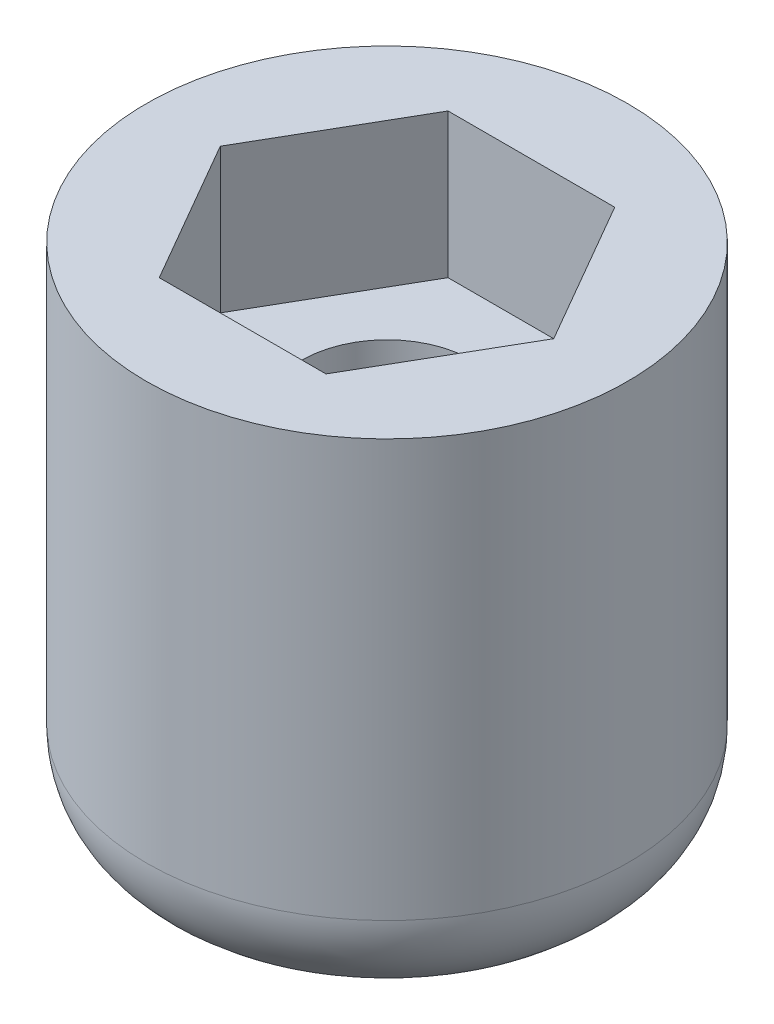
ISO-10303-21;
HEADER;
FILE_DESCRIPTION(('STEP AP214'),'2;1');
FILE_NAME('part.step','',(''),(''),'','','');
FILE_SCHEMA(('AUTOMOTIVE_DESIGN { 1 0 10303 214 1 1 1 1 }'));
ENDSEC;
DATA;
#1=APPLICATION_CONTEXT('core data for automotive mechanical design processes');
#2=APPLICATION_PROTOCOL_DEFINITION('international standard','automotive_design',2000,#1);
#3=PRODUCT_CONTEXT('',#1,'mechanical');
#4=PRODUCT('Part','Part','',(#3));
#5=PRODUCT_RELATED_PRODUCT_CATEGORY('part','',(#4));
#6=PRODUCT_DEFINITION_FORMATION('','',#4);
#7=PRODUCT_DEFINITION_CONTEXT('part definition',#1,'design');
#8=PRODUCT_DEFINITION('design','',#6,#7);
#9=PRODUCT_DEFINITION_SHAPE('','',#8);
#10=(LENGTH_UNIT() NAMED_UNIT(*) SI_UNIT(.MILLI.,.METRE.));
#11=(NAMED_UNIT(*) PLANE_ANGLE_UNIT() SI_UNIT($,.RADIAN.));
#12=(NAMED_UNIT(*) SI_UNIT($,.STERADIAN.) SOLID_ANGLE_UNIT());
#13=UNCERTAINTY_MEASURE_WITH_UNIT(LENGTH_MEASURE(1.E-05),#10,'distance_accuracy_value','');
#14=(GEOMETRIC_REPRESENTATION_CONTEXT(3) GLOBAL_UNCERTAINTY_ASSIGNED_CONTEXT((#13)) GLOBAL_UNIT_ASSIGNED_CONTEXT((#10,
#11,#12)) REPRESENTATION_CONTEXT('',''));
#15=CARTESIAN_POINT('',(0.,0.,0.));
#16=DIRECTION('',(0.,0.,1.));
#17=DIRECTION('',(1.,0.,0.));
#18=AXIS2_PLACEMENT_3D('',#15,#16,#17);
#19=CARTESIAN_POINT('',(0.,16.,0.));
#20=DIRECTION('',(0.,-1.,0.));
#21=DIRECTION('',(0.,0.,-1.));
#22=AXIS2_PLACEMENT_3D('',#19,#20,#21);
#23=CYLINDRICAL_SURFACE('',#22,2.65);
#24=CARTESIAN_POINT('',(0.,10.,0.));
#25=DIRECTION('',(0.,1.,0.));
#26=DIRECTION('',(0.,0.,1.));
#27=AXIS2_PLACEMENT_3D('',#24,#25,#26);
#28=CIRCLE('',#27,2.65);
#29=CARTESIAN_POINT('',(0.,10.,2.65));
#30=VERTEX_POINT('',#29);
#31=EDGE_CURVE('E146',#30,#30,#28,.T.);
#32=ORIENTED_EDGE('',*,*,#31,.F.);
#33=EDGE_LOOP('',(#32));
#34=FACE_BOUND('',#33,.T.);
#35=CARTESIAN_POINT('',(0.,11.5,0.));
#36=DIRECTION('',(0.,1.,0.));
#37=DIRECTION('',(0.,0.,1.));
#38=AXIS2_PLACEMENT_3D('',#35,#36,#37);
#39=CIRCLE('',#38,2.65);
#40=CARTESIAN_POINT('',(0.,11.5,2.65));
#41=VERTEX_POINT('',#40);
#42=EDGE_CURVE('E140',#41,#41,#39,.T.);
#43=ORIENTED_EDGE('',*,*,#42,.T.);
#44=EDGE_LOOP('',(#43));
#45=FACE_BOUND('',#44,.T.);
#46=ADVANCED_FACE('F38',(#34,#45),#23,.F.);
#47=CARTESIAN_POINT('',(0.,10.,0.));
#48=DIRECTION('',(0.,-1.,0.));
#49=DIRECTION('',(0.,0.,-1.));
#50=AXIS2_PLACEMENT_3D('',#47,#48,#49);
#51=CYLINDRICAL_SURFACE('',#50,7.5);
#52=CARTESIAN_POINT('',(0.,3.,0.));
#53=DIRECTION('',(0.,1.,0.));
#54=DIRECTION('',(0.,0.,1.));
#55=AXIS2_PLACEMENT_3D('',#52,#53,#54);
#56=CIRCLE('',#55,7.5);
#57=CARTESIAN_POINT('',(0.,3.,7.5));
#58=VERTEX_POINT('',#57);
#59=EDGE_CURVE('E155',#58,#58,#56,.T.);
#60=ORIENTED_EDGE('',*,*,#59,.T.);
#61=EDGE_LOOP('',(#60));
#62=FACE_BOUND('',#61,.T.);
#63=CARTESIAN_POINT('',(0.,16.,0.));
#64=DIRECTION('',(0.,1.,0.));
#65=DIRECTION('',(0.,0.,1.));
#66=AXIS2_PLACEMENT_3D('',#63,#64,#65);
#67=CIRCLE('',#66,7.5);
#68=CARTESIAN_POINT('',(0.,16.,7.5));
#69=VERTEX_POINT('',#68);
#70=EDGE_CURVE('E149',#69,#69,#67,.T.);
#71=ORIENTED_EDGE('',*,*,#70,.F.);
#72=EDGE_LOOP('',(#71));
#73=FACE_BOUND('',#72,.T.);
#74=ADVANCED_FACE('F172',(#62,#73),#51,.T.);
#75=CARTESIAN_POINT('',(0.,10.,0.));
#76=DIRECTION('',(0.,-1.,0.));
#77=DIRECTION('',(0.,0.,-1.));
#78=AXIS2_PLACEMENT_3D('',#75,#76,#77);
#79=CYLINDRICAL_SURFACE('',#78,4.5);
#80=CARTESIAN_POINT('',(0.,1.26794919243112,0.));
#81=DIRECTION('',(0.,-1.,0.));
#82=DIRECTION('',(0.,0.,-1.));
#83=AXIS2_PLACEMENT_3D('',#80,#81,#82);
#84=CIRCLE('',#83,4.5);
#85=CARTESIAN_POINT('',(0.,1.26794919243112,-4.5));
#86=VERTEX_POINT('',#85);
#87=EDGE_CURVE('E11',#86,#86,#84,.T.);
#88=ORIENTED_EDGE('',*,*,#87,.T.);
#89=EDGE_LOOP('',(#88));
#90=FACE_BOUND('',#89,.T.);
#91=CARTESIAN_POINT('',(0.,10.,0.));
#92=DIRECTION('',(0.,1.,0.));
#93=DIRECTION('',(0.,0.,1.));
#94=AXIS2_PLACEMENT_3D('',#91,#92,#93);
#95=CIRCLE('',#94,4.5);
#96=CARTESIAN_POINT('',(0.,10.,4.5));
#97=VERTEX_POINT('',#96);
#98=EDGE_CURVE('E152',#97,#97,#95,.T.);
#99=ORIENTED_EDGE('',*,*,#98,.T.);
#100=EDGE_LOOP('',(#99));
#101=FACE_BOUND('',#100,.T.);
#102=ADVANCED_FACE('F179',(#90,#101),#79,.F.);
#103=CARTESIAN_POINT('',(0.,10.,0.));
#104=DIRECTION('',(0.,1.,0.));
#105=DIRECTION('',(0.,0.,1.));
#106=AXIS2_PLACEMENT_3D('',#103,#104,#105);
#107=PLANE('',#106);
#108=ORIENTED_EDGE('',*,*,#31,.T.);
#109=EDGE_LOOP('',(#108));
#110=FACE_BOUND('',#109,.T.);
#111=ORIENTED_EDGE('',*,*,#98,.F.);
#112=EDGE_LOOP('',(#111));
#113=FACE_BOUND('',#112,.T.);
#114=ADVANCED_FACE('F191',(#110,#113),#107,.F.);
#115=CARTESIAN_POINT('',(0.,16.,0.));
#116=DIRECTION('',(0.,1.,0.));
#117=DIRECTION('',(0.,0.,1.));
#118=AXIS2_PLACEMENT_3D('',#115,#116,#117);
#119=PLANE('',#118);
#120=DIRECTION('',(-0.500000000000001,0.,-0.866025403784438));
#121=VECTOR('',#120,1.);
#122=CARTESIAN_POINT('',(5.19615242270663,16.,0.));
#123=LINE('',#122,#121);
#124=CARTESIAN_POINT('',(5.19615242270663,16.,0.));
#125=VERTEX_POINT('',#124);
#126=CARTESIAN_POINT('',(2.59807621135331,16.,-4.5));
#127=VERTEX_POINT('',#126);
#128=EDGE_CURVE('E53',#125,#127,#123,.T.);
#129=ORIENTED_EDGE('',*,*,#128,.F.);
#130=DIRECTION('',(0.5,0.,-0.866025403784439));
#131=VECTOR('',#130,1.);
#132=CARTESIAN_POINT('',(2.59807621135332,16.,4.5));
#133=LINE('',#132,#131);
#134=CARTESIAN_POINT('',(2.59807621135332,16.,4.5));
#135=VERTEX_POINT('',#134);
#136=EDGE_CURVE('E136',#135,#125,#133,.T.);
#137=ORIENTED_EDGE('',*,*,#136,.F.);
#138=DIRECTION('',(1.,0.,0.));
#139=VECTOR('',#138,1.);
#140=CARTESIAN_POINT('',(-2.59807621135331,16.,4.5));
#141=LINE('',#140,#139);
#142=CARTESIAN_POINT('',(-2.59807621135331,16.,4.5));
#143=VERTEX_POINT('',#142);
#144=EDGE_CURVE('E134',#143,#135,#141,.T.);
#145=ORIENTED_EDGE('',*,*,#144,.F.);
#146=DIRECTION('',(0.5,0.,0.866025403784438));
#147=VECTOR('',#146,1.);
#148=CARTESIAN_POINT('',(-5.19615242270663,16.,0.));
#149=LINE('',#148,#147);
#150=CARTESIAN_POINT('',(-5.19615242270663,16.,0.));
#151=VERTEX_POINT('',#150);
#152=EDGE_CURVE('E101',#151,#143,#149,.T.);
#153=ORIENTED_EDGE('',*,*,#152,.F.);
#154=DIRECTION('',(-0.5,0.,0.866025403784439));
#155=VECTOR('',#154,1.);
#156=CARTESIAN_POINT('',(-2.59807621135331,16.,-4.5));
#157=LINE('',#156,#155);
#158=CARTESIAN_POINT('',(-2.59807621135331,16.,-4.5));
#159=VERTEX_POINT('',#158);
#160=EDGE_CURVE('E130',#159,#151,#157,.T.);
#161=ORIENTED_EDGE('',*,*,#160,.F.);
#162=DIRECTION('',(-1.,0.,0.));
#163=VECTOR('',#162,1.);
#164=CARTESIAN_POINT('',(2.59807621135331,16.,-4.5));
#165=LINE('',#164,#163);
#166=EDGE_CURVE('E127',#127,#159,#165,.T.);
#167=ORIENTED_EDGE('',*,*,#166,.F.);
#168=EDGE_LOOP('',(#129,#137,#145,#153,#161,#167));
#169=FACE_BOUND('',#168,.T.);
#170=ORIENTED_EDGE('',*,*,#70,.T.);
#171=EDGE_LOOP('',(#170));
#172=FACE_BOUND('',#171,.T.);
#173=ADVANCED_FACE('F188',(#169,#172),#119,.T.);
#174=CARTESIAN_POINT('',(5.19615242270663,11.5,0.));
#175=DIRECTION('',(0.866025403784438,0.,-0.500000000000001));
#176=DIRECTION('',(-0.500000000000001,0.,-0.866025403784438));
#177=AXIS2_PLACEMENT_3D('',#174,#175,#176);
#178=PLANE('',#177);
#179=ORIENTED_EDGE('',*,*,#128,.T.);
#180=DIRECTION('',(0.,1.,0.));
#181=VECTOR('',#180,1.);
#182=CARTESIAN_POINT('',(2.59807621135331,11.5,-4.5));
#183=LINE('',#182,#181);
#184=CARTESIAN_POINT('',(2.59807621135331,11.5,-4.5));
#185=VERTEX_POINT('',#184);
#186=EDGE_CURVE('E83',#185,#127,#183,.T.);
#187=ORIENTED_EDGE('',*,*,#186,.F.);
#188=DIRECTION('',(-0.500000000000001,0.,-0.866025403784438));
#189=VECTOR('',#188,1.);
#190=CARTESIAN_POINT('',(5.19615242270663,11.5,0.));
#191=LINE('',#190,#189);
#192=CARTESIAN_POINT('',(5.19615242270663,11.5,0.));
#193=VERTEX_POINT('',#192);
#194=EDGE_CURVE('E138',#193,#185,#191,.T.);
#195=ORIENTED_EDGE('',*,*,#194,.F.);
#196=DIRECTION('',(0.,1.,0.));
#197=VECTOR('',#196,1.);
#198=CARTESIAN_POINT('',(5.19615242270663,11.5,0.));
#199=LINE('',#198,#197);
#200=EDGE_CURVE('E61',#193,#125,#199,.T.);
#201=ORIENTED_EDGE('',*,*,#200,.T.);
#202=EDGE_LOOP('',(#179,#187,#195,#201));
#203=FACE_BOUND('',#202,.T.);
#204=ADVANCED_FACE('F186',(#203),#178,.F.);
#205=CARTESIAN_POINT('',(2.59807621135332,11.5,4.5));
#206=DIRECTION('',(0.866025403784439,0.,0.5));
#207=DIRECTION('',(0.5,0.,-0.866025403784439));
#208=AXIS2_PLACEMENT_3D('',#205,#206,#207);
#209=PLANE('',#208);
#210=ORIENTED_EDGE('',*,*,#136,.T.);
#211=ORIENTED_EDGE('',*,*,#200,.F.);
#212=DIRECTION('',(0.5,0.,-0.866025403784439));
#213=VECTOR('',#212,1.);
#214=CARTESIAN_POINT('',(2.59807621135332,11.5,4.5));
#215=LINE('',#214,#213);
#216=CARTESIAN_POINT('',(2.59807621135332,11.5,4.5));
#217=VERTEX_POINT('',#216);
#218=EDGE_CURVE('E113',#217,#193,#215,.T.);
#219=ORIENTED_EDGE('',*,*,#218,.F.);
#220=DIRECTION('',(0.,1.,0.));
#221=VECTOR('',#220,1.);
#222=CARTESIAN_POINT('',(2.59807621135332,11.5,4.5));
#223=LINE('',#222,#221);
#224=EDGE_CURVE('E105',#217,#135,#223,.T.);
#225=ORIENTED_EDGE('',*,*,#224,.T.);
#226=EDGE_LOOP('',(#210,#211,#219,#225));
#227=FACE_BOUND('',#226,.T.);
#228=ADVANCED_FACE('F261',(#227),#209,.F.);
#229=CARTESIAN_POINT('',(-2.59807621135331,11.5,4.5));
#230=DIRECTION('',(0.,0.,1.));
#231=DIRECTION('',(1.,0.,0.));
#232=AXIS2_PLACEMENT_3D('',#229,#230,#231);
#233=PLANE('',#232);
#234=ORIENTED_EDGE('',*,*,#144,.T.);
#235=ORIENTED_EDGE('',*,*,#224,.F.);
#236=DIRECTION('',(1.,0.,0.));
#237=VECTOR('',#236,1.);
#238=CARTESIAN_POINT('',(-2.59807621135331,11.5,4.5));
#239=LINE('',#238,#237);
#240=CARTESIAN_POINT('',(-2.59807621135331,11.5,4.5));
#241=VERTEX_POINT('',#240);
#242=EDGE_CURVE('E109',#241,#217,#239,.T.);
#243=ORIENTED_EDGE('',*,*,#242,.F.);
#244=DIRECTION('',(0.,1.,0.));
#245=VECTOR('',#244,1.);
#246=CARTESIAN_POINT('',(-2.59807621135331,11.5,4.5));
#247=LINE('',#246,#245);
#248=EDGE_CURVE('E94',#241,#143,#247,.T.);
#249=ORIENTED_EDGE('',*,*,#248,.T.);
#250=EDGE_LOOP('',(#234,#235,#243,#249));
#251=FACE_BOUND('',#250,.T.);
#252=ADVANCED_FACE('F110',(#251),#233,.F.);
#253=CARTESIAN_POINT('',(-5.19615242270663,11.5,0.));
#254=DIRECTION('',(-0.866025403784438,0.,0.5));
#255=DIRECTION('',(0.5,0.,0.866025403784439));
#256=AXIS2_PLACEMENT_3D('',#253,#254,#255);
#257=PLANE('',#256);
#258=ORIENTED_EDGE('',*,*,#152,.T.);
#259=ORIENTED_EDGE('',*,*,#248,.F.);
#260=DIRECTION('',(0.5,0.,0.866025403784438));
#261=VECTOR('',#260,1.);
#262=CARTESIAN_POINT('',(-5.19615242270663,11.5,0.));
#263=LINE('',#262,#261);
#264=CARTESIAN_POINT('',(-5.19615242270663,11.5,0.));
#265=VERTEX_POINT('',#264);
#266=EDGE_CURVE('E98',#265,#241,#263,.T.);
#267=ORIENTED_EDGE('',*,*,#266,.F.);
#268=DIRECTION('',(0.,1.,0.));
#269=VECTOR('',#268,1.);
#270=CARTESIAN_POINT('',(-5.19615242270663,11.5,0.));
#271=LINE('',#270,#269);
#272=EDGE_CURVE('E106',#265,#151,#271,.T.);
#273=ORIENTED_EDGE('',*,*,#272,.T.);
#274=EDGE_LOOP('',(#258,#259,#267,#273));
#275=FACE_BOUND('',#274,.T.);
#276=ADVANCED_FACE('F96',(#275),#257,.F.);
#277=CARTESIAN_POINT('',(-2.59807621135331,11.5,-4.5));
#278=DIRECTION('',(-0.866025403784439,0.,-0.5));
#279=DIRECTION('',(-0.5,0.,0.866025403784439));
#280=AXIS2_PLACEMENT_3D('',#277,#278,#279);
#281=PLANE('',#280);
#282=ORIENTED_EDGE('',*,*,#160,.T.);
#283=ORIENTED_EDGE('',*,*,#272,.F.);
#284=DIRECTION('',(-0.5,0.,0.866025403784439));
#285=VECTOR('',#284,1.);
#286=CARTESIAN_POINT('',(-2.59807621135331,11.5,-4.5));
#287=LINE('',#286,#285);
#288=CARTESIAN_POINT('',(-2.59807621135331,11.5,-4.5));
#289=VERTEX_POINT('',#288);
#290=EDGE_CURVE('E119',#289,#265,#287,.T.);
#291=ORIENTED_EDGE('',*,*,#290,.F.);
#292=DIRECTION('',(0.,1.,0.));
#293=VECTOR('',#292,1.);
#294=CARTESIAN_POINT('',(-2.59807621135331,11.5,-4.5));
#295=LINE('',#294,#293);
#296=EDGE_CURVE('E143',#289,#159,#295,.T.);
#297=ORIENTED_EDGE('',*,*,#296,.T.);
#298=EDGE_LOOP('',(#282,#283,#291,#297));
#299=FACE_BOUND('',#298,.T.);
#300=ADVANCED_FACE('F235',(#299),#281,.F.);
#301=CARTESIAN_POINT('',(2.59807621135331,11.5,-4.5));
#302=DIRECTION('',(0.,0.,-1.));
#303=DIRECTION('',(-1.,0.,0.));
#304=AXIS2_PLACEMENT_3D('',#301,#302,#303);
#305=PLANE('',#304);
#306=ORIENTED_EDGE('',*,*,#166,.T.);
#307=ORIENTED_EDGE('',*,*,#296,.F.);
#308=DIRECTION('',(-1.,0.,0.));
#309=VECTOR('',#308,1.);
#310=CARTESIAN_POINT('',(2.59807621135331,11.5,-4.5));
#311=LINE('',#310,#309);
#312=EDGE_CURVE('E121',#185,#289,#311,.T.);
#313=ORIENTED_EDGE('',*,*,#312,.F.);
#314=ORIENTED_EDGE('',*,*,#186,.T.);
#315=EDGE_LOOP('',(#306,#307,#313,#314));
#316=FACE_BOUND('',#315,.T.);
#317=ADVANCED_FACE('F226',(#316),#305,.F.);
#318=CARTESIAN_POINT('',(0.,11.5,0.));
#319=DIRECTION('',(0.,1.,0.));
#320=DIRECTION('',(0.,0.,1.));
#321=AXIS2_PLACEMENT_3D('',#318,#319,#320);
#322=PLANE('',#321);
#323=ORIENTED_EDGE('',*,*,#42,.F.);
#324=EDGE_LOOP('',(#323));
#325=FACE_BOUND('',#324,.T.);
#326=ORIENTED_EDGE('',*,*,#194,.T.);
#327=ORIENTED_EDGE('',*,*,#312,.T.);
#328=ORIENTED_EDGE('',*,*,#290,.T.);
#329=ORIENTED_EDGE('',*,*,#266,.T.);
#330=ORIENTED_EDGE('',*,*,#242,.T.);
#331=ORIENTED_EDGE('',*,*,#218,.T.);
#332=EDGE_LOOP('',(#326,#327,#328,#329,#330,#331));
#333=FACE_BOUND('',#332,.T.);
#334=ADVANCED_FACE('F116',(#325,#333),#322,.T.);
#335=CARTESIAN_POINT('',(0.,3.,0.));
#336=DIRECTION('',(0.,1.,0.));
#337=DIRECTION('',(0.,0.,1.));
#338=AXIS2_PLACEMENT_3D('',#335,#336,#337);
#339=TOROIDAL_SURFACE('',#338,4.5,3.);
#340=CARTESIAN_POINT('',(0.,0.401923788646683,0.));
#341=DIRECTION('',(0.,1.,0.));
#342=DIRECTION('',(0.,0.,1.));
#343=AXIS2_PLACEMENT_3D('',#340,#341,#342);
#344=CIRCLE('',#343,6.);
#345=CARTESIAN_POINT('',(0.,0.401923788646683,6.));
#346=VERTEX_POINT('',#345);
#347=EDGE_CURVE('E46',#346,#346,#344,.T.);
#348=ORIENTED_EDGE('',*,*,#347,.T.);
#349=EDGE_LOOP('',(#348));
#350=FACE_BOUND('',#349,.T.);
#351=ORIENTED_EDGE('',*,*,#59,.F.);
#352=EDGE_LOOP('',(#351));
#353=FACE_BOUND('',#352,.T.);
#354=ADVANCED_FACE('F162',(#350,#353),#339,.T.);
#355=CARTESIAN_POINT('',(0.,1.26794919243112,0.));
#356=DIRECTION('',(0.,-1.,0.));
#357=DIRECTION('',(0.,0.,-1.));
#358=AXIS2_PLACEMENT_3D('',#355,#356,#357);
#359=TOROIDAL_SURFACE('',#358,5.5,1.);
#360=ORIENTED_EDGE('',*,*,#87,.F.);
#361=EDGE_LOOP('',(#360));
#362=FACE_BOUND('',#361,.T.);
#363=ORIENTED_EDGE('',*,*,#347,.F.);
#364=EDGE_LOOP('',(#363));
#365=FACE_BOUND('',#364,.T.);
#366=ADVANCED_FACE('F40',(#362,#365),#359,.T.);
#367=CLOSED_SHELL('',(#46,#74,#102,#114,#173,#204,#228,#252,#276,#300,#317,#334,#354,#366));
#368=MANIFOLD_SOLID_BREP('B2',#367);
#369=ADVANCED_BREP_SHAPE_REPRESENTATION('',(#18,#368),#14);
#370=SHAPE_DEFINITION_REPRESENTATION(#9,#369);
ENDSEC;
END-ISO-10303-21;
